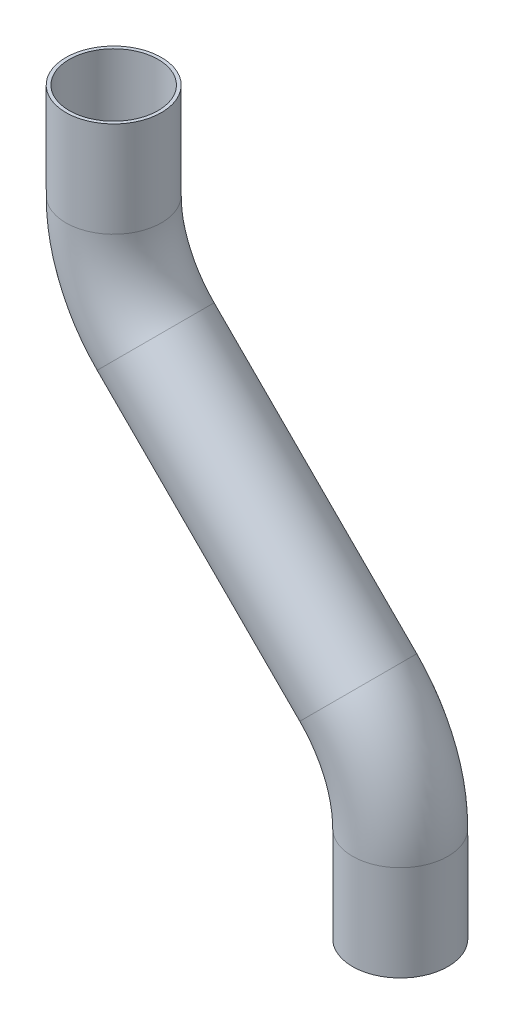
ISO-10303-21;
HEADER;
FILE_DESCRIPTION(('STEP AP214'),'2;1');
FILE_NAME('part.step','',(''),(''),'','','');
FILE_SCHEMA(('AUTOMOTIVE_DESIGN { 1 0 10303 214 1 1 1 1 }'));
ENDSEC;
DATA;
#1=APPLICATION_CONTEXT('core data for automotive mechanical design processes');
#2=APPLICATION_PROTOCOL_DEFINITION('international standard','automotive_design',2000,#1);
#3=PRODUCT_CONTEXT('',#1,'mechanical');
#4=PRODUCT('Part','Part','',(#3));
#5=PRODUCT_RELATED_PRODUCT_CATEGORY('part','',(#4));
#6=PRODUCT_DEFINITION_FORMATION('','',#4);
#7=PRODUCT_DEFINITION_CONTEXT('part definition',#1,'design');
#8=PRODUCT_DEFINITION('design','',#6,#7);
#9=PRODUCT_DEFINITION_SHAPE('','',#8);
#10=(LENGTH_UNIT() NAMED_UNIT(*) SI_UNIT(.MILLI.,.METRE.));
#11=(NAMED_UNIT(*) PLANE_ANGLE_UNIT() SI_UNIT($,.RADIAN.));
#12=(NAMED_UNIT(*) SI_UNIT($,.STERADIAN.) SOLID_ANGLE_UNIT());
#13=UNCERTAINTY_MEASURE_WITH_UNIT(LENGTH_MEASURE(1.E-05),#10,'distance_accuracy_value','');
#14=(GEOMETRIC_REPRESENTATION_CONTEXT(3) GLOBAL_UNCERTAINTY_ASSIGNED_CONTEXT((#13)) GLOBAL_UNIT_ASSIGNED_CONTEXT((#10,
#11,#12)) REPRESENTATION_CONTEXT('',''));
#15=CARTESIAN_POINT('',(0.,0.,0.));
#16=DIRECTION('',(0.,0.,1.));
#17=DIRECTION('',(1.,0.,0.));
#18=AXIS2_PLACEMENT_3D('',#15,#16,#17);
#19=CARTESIAN_POINT('',(0.,0.,0.));
#20=DIRECTION('',(0.,1.,0.));
#21=DIRECTION('',(0.,0.,1.));
#22=AXIS2_PLACEMENT_3D('',#19,#20,#21);
#23=CYLINDRICAL_SURFACE('',#22,12.7);
#24=CARTESIAN_POINT('',(0.,25.4,0.));
#25=DIRECTION('',(0.,1.,0.));
#26=DIRECTION('',(0.,0.,1.));
#27=AXIS2_PLACEMENT_3D('',#24,#25,#26);
#28=CIRCLE('',#27,12.7);
#29=CARTESIAN_POINT('',(12.7,25.4,0.));
#30=VERTEX_POINT('',#29);
#31=EDGE_CURVE('E55',#30,#30,#28,.T.);
#32=ORIENTED_EDGE('',*,*,#31,.F.);
#33=EDGE_LOOP('',(#32));
#34=FACE_BOUND('',#33,.T.);
#35=CARTESIAN_POINT('',(0.,0.,0.));
#36=DIRECTION('',(0.,1.,0.));
#37=DIRECTION('',(0.,0.,1.));
#38=AXIS2_PLACEMENT_3D('',#35,#36,#37);
#39=CIRCLE('',#38,12.7);
#40=CARTESIAN_POINT('',(0.,0.,12.7));
#41=VERTEX_POINT('',#40);
#42=EDGE_CURVE('E52',#41,#41,#39,.T.);
#43=ORIENTED_EDGE('',*,*,#42,.T.);
#44=EDGE_LOOP('',(#43));
#45=FACE_BOUND('',#44,.T.);
#46=ADVANCED_FACE('F31',(#34,#45),#23,.T.);
#47=CARTESIAN_POINT('',(-38.1,25.4,0.));
#48=DIRECTION('',(0.,0.,1.));
#49=DIRECTION('',(1.,0.,0.));
#50=AXIS2_PLACEMENT_3D('',#47,#48,#49);
#51=TOROIDAL_SURFACE('',#50,38.1,12.7);
#52=CARTESIAN_POINT('',(-11.1592316367926,52.3407683632075,0.));
#53=DIRECTION('',(-0.707106781186549,0.707106781186546,0.));
#54=DIRECTION('',(0.,0.,1.));
#55=AXIS2_PLACEMENT_3D('',#52,#53,#54);
#56=CIRCLE('',#55,12.7);
#57=CARTESIAN_POINT('',(-2.17897551572346,61.3210244842767,0.));
#58=VERTEX_POINT('',#57);
#59=EDGE_CURVE('E58',#58,#58,#56,.T.);
#60=CARTESIAN_POINT('',(-38.1,25.4,0.));
#61=DIRECTION('',(0.,0.,1.));
#62=DIRECTION('',(1.,0.,0.));
#63=AXIS2_PLACEMENT_3D('',#60,#61,#62);
#64=CIRCLE('',#63,50.8);
#65=EDGE_CURVE('',#30,#58,#64,.T.);
#66=ORIENTED_EDGE('',*,*,#31,.T.);
#67=ORIENTED_EDGE('',*,*,#59,.F.);
#68=ORIENTED_EDGE('',*,*,#65,.T.);
#69=ORIENTED_EDGE('',*,*,#65,.F.);
#70=EDGE_LOOP('',(#66,#68,#67,#69));
#71=FACE_BOUND('',#70,.T.);
#72=ADVANCED_FACE('F77',(#71),#51,.T.);
#73=CARTESIAN_POINT('',(-11.1592316367926,52.3407683632075,0.));
#74=DIRECTION('',(-0.707106781186549,0.707106781186546,0.));
#75=DIRECTION('',(-0.707106781186546,-0.707106781186549,0.));
#76=AXIS2_PLACEMENT_3D('',#73,#74,#75);
#77=CYLINDRICAL_SURFACE('',#76,12.7);
#78=CARTESIAN_POINT('',(-65.0407683632074,106.222305089622,0.));
#79=DIRECTION('',(-0.707106781186549,0.707106781186546,0.));
#80=DIRECTION('',(0.,0.,1.));
#81=AXIS2_PLACEMENT_3D('',#78,#79,#80);
#82=CIRCLE('',#81,12.7);
#83=CARTESIAN_POINT('',(-74.0210244842766,97.242048968553,0.));
#84=VERTEX_POINT('',#83);
#85=EDGE_CURVE('E60',#84,#84,#82,.T.);
#86=ORIENTED_EDGE('',*,*,#85,.F.);
#87=EDGE_LOOP('',(#86));
#88=FACE_BOUND('',#87,.T.);
#89=ORIENTED_EDGE('',*,*,#59,.T.);
#90=EDGE_LOOP('',(#89));
#91=FACE_BOUND('',#90,.T.);
#92=ADVANCED_FACE('F70',(#88,#91),#77,.T.);
#93=CARTESIAN_POINT('',(-38.1,133.16307345283,0.));
#94=DIRECTION('',(0.,0.,-1.));
#95=DIRECTION('',(-1.,0.,0.));
#96=AXIS2_PLACEMENT_3D('',#93,#94,#95);
#97=TOROIDAL_SURFACE('',#96,38.1,12.7);
#98=CARTESIAN_POINT('',(-76.2,133.16307345283,0.));
#99=DIRECTION('',(0.,1.,0.));
#100=DIRECTION('',(0.,0.,1.));
#101=AXIS2_PLACEMENT_3D('',#98,#99,#100);
#102=CIRCLE('',#101,12.7);
#103=CARTESIAN_POINT('',(-88.9,133.16307345283,0.));
#104=VERTEX_POINT('',#103);
#105=EDGE_CURVE('E35',#104,#104,#102,.T.);
#106=CARTESIAN_POINT('',(-38.1,133.16307345283,0.));
#107=DIRECTION('',(0.,0.,-1.));
#108=DIRECTION('',(-1.,0.,0.));
#109=AXIS2_PLACEMENT_3D('',#106,#107,#108);
#110=CIRCLE('',#109,50.8);
#111=EDGE_CURVE('',#84,#104,#110,.T.);
#112=ORIENTED_EDGE('',*,*,#85,.T.);
#113=ORIENTED_EDGE('',*,*,#105,.F.);
#114=ORIENTED_EDGE('',*,*,#111,.T.);
#115=ORIENTED_EDGE('',*,*,#111,.F.);
#116=EDGE_LOOP('',(#112,#114,#113,#115));
#117=FACE_BOUND('',#116,.T.);
#118=ADVANCED_FACE('F68',(#117),#97,.T.);
#119=CARTESIAN_POINT('',(-76.2,133.16307345283,0.));
#120=DIRECTION('',(0.,1.,0.));
#121=DIRECTION('',(0.,0.,1.));
#122=AXIS2_PLACEMENT_3D('',#119,#120,#121);
#123=CYLINDRICAL_SURFACE('',#122,12.7);
#124=CARTESIAN_POINT('',(-76.2,158.56307345283,0.));
#125=DIRECTION('',(0.,1.,0.));
#126=DIRECTION('',(0.,0.,1.));
#127=AXIS2_PLACEMENT_3D('',#124,#125,#126);
#128=CIRCLE('',#127,12.7);
#129=CARTESIAN_POINT('',(-76.2,158.56307345283,12.7));
#130=VERTEX_POINT('',#129);
#131=EDGE_CURVE('E48',#130,#130,#128,.T.);
#132=ORIENTED_EDGE('',*,*,#131,.F.);
#133=EDGE_LOOP('',(#132));
#134=FACE_BOUND('',#133,.T.);
#135=ORIENTED_EDGE('',*,*,#105,.T.);
#136=EDGE_LOOP('',(#135));
#137=FACE_BOUND('',#136,.T.);
#138=ADVANCED_FACE('F33',(#134,#137),#123,.T.);
#139=CARTESIAN_POINT('',(0.,0.,0.));
#140=DIRECTION('',(0.,1.,0.));
#141=DIRECTION('',(0.,0.,1.));
#142=AXIS2_PLACEMENT_3D('',#139,#140,#141);
#143=PLANE('',#142);
#144=CARTESIAN_POINT('',(0.,0.,0.));
#145=DIRECTION('',(0.,1.,0.));
#146=DIRECTION('',(0.,0.,1.));
#147=AXIS2_PLACEMENT_3D('',#144,#145,#146);
#148=CIRCLE('',#147,11.811);
#149=CARTESIAN_POINT('',(0.,0.,11.811));
#150=VERTEX_POINT('',#149);
#151=EDGE_CURVE('E51',#150,#150,#148,.F.);
#152=ORIENTED_EDGE('',*,*,#151,.F.);
#153=EDGE_LOOP('',(#152));
#154=FACE_BOUND('',#153,.T.);
#155=ORIENTED_EDGE('',*,*,#42,.F.);
#156=EDGE_LOOP('',(#155));
#157=FACE_BOUND('',#156,.T.);
#158=ADVANCED_FACE('F75',(#154,#157),#143,.F.);
#159=CARTESIAN_POINT('',(-76.2,158.56307345283,0.));
#160=DIRECTION('',(0.,1.,0.));
#161=DIRECTION('',(0.,0.,1.));
#162=AXIS2_PLACEMENT_3D('',#159,#160,#161);
#163=PLANE('',#162);
#164=CARTESIAN_POINT('',(-76.2,158.56307345283,0.));
#165=DIRECTION('',(0.,1.,0.));
#166=DIRECTION('',(0.,0.,1.));
#167=AXIS2_PLACEMENT_3D('',#164,#165,#166);
#168=CIRCLE('',#167,11.811);
#169=CARTESIAN_POINT('',(-76.2,158.56307345283,11.811));
#170=VERTEX_POINT('',#169);
#171=EDGE_CURVE('E10',#170,#170,#168,.F.);
#172=ORIENTED_EDGE('',*,*,#171,.T.);
#173=EDGE_LOOP('',(#172));
#174=FACE_BOUND('',#173,.T.);
#175=ORIENTED_EDGE('',*,*,#131,.T.);
#176=EDGE_LOOP('',(#175));
#177=FACE_BOUND('',#176,.T.);
#178=ADVANCED_FACE('F94',(#174,#177),#163,.T.);
#179=CARTESIAN_POINT('',(0.,0.,0.));
#180=DIRECTION('',(0.,1.,0.));
#181=DIRECTION('',(0.,0.,1.));
#182=AXIS2_PLACEMENT_3D('',#179,#180,#181);
#183=CYLINDRICAL_SURFACE('',#182,11.811);
#184=CARTESIAN_POINT('',(0.,25.4,0.));
#185=DIRECTION('',(0.,1.,0.));
#186=DIRECTION('',(0.,0.,1.));
#187=AXIS2_PLACEMENT_3D('',#184,#185,#186);
#188=CIRCLE('',#187,11.811);
#189=CARTESIAN_POINT('',(11.811,25.4,0.));
#190=VERTEX_POINT('',#189);
#191=EDGE_CURVE('E190',#190,#190,#188,.F.);
#192=ORIENTED_EDGE('',*,*,#191,.F.);
#193=EDGE_LOOP('',(#192));
#194=FACE_BOUND('',#193,.T.);
#195=ORIENTED_EDGE('',*,*,#151,.T.);
#196=EDGE_LOOP('',(#195));
#197=FACE_BOUND('',#196,.T.);
#198=ADVANCED_FACE('F97',(#194,#197),#183,.F.);
#199=CARTESIAN_POINT('',(-38.1,25.4,0.));
#200=DIRECTION('',(0.,0.,1.));
#201=DIRECTION('',(1.,0.,0.));
#202=AXIS2_PLACEMENT_3D('',#199,#200,#201);
#203=TOROIDAL_SURFACE('',#202,38.1,11.811);
#204=CARTESIAN_POINT('',(-11.1592316367926,52.3407683632075,0.));
#205=DIRECTION('',(-0.707106781186549,0.707106781186546,0.));
#206=DIRECTION('',(0.,0.,1.));
#207=AXIS2_PLACEMENT_3D('',#204,#205,#206);
#208=CIRCLE('',#207,11.811);
#209=CARTESIAN_POINT('',(-2.80759344419829,60.6924065558018,0.));
#210=VERTEX_POINT('',#209);
#211=EDGE_CURVE('E189',#210,#210,#208,.F.);
#212=CARTESIAN_POINT('',(-38.1,25.4,0.));
#213=DIRECTION('',(0.,0.,1.));
#214=DIRECTION('',(1.,0.,0.));
#215=AXIS2_PLACEMENT_3D('',#212,#213,#214);
#216=CIRCLE('',#215,49.911);
#217=EDGE_CURVE('',#190,#210,#216,.T.);
#218=ORIENTED_EDGE('',*,*,#191,.T.);
#219=ORIENTED_EDGE('',*,*,#211,.F.);
#220=ORIENTED_EDGE('',*,*,#217,.T.);
#221=ORIENTED_EDGE('',*,*,#217,.F.);
#222=EDGE_LOOP('',(#218,#220,#219,#221));
#223=FACE_BOUND('',#222,.T.);
#224=ADVANCED_FACE('F152',(#223),#203,.F.);
#225=CARTESIAN_POINT('',(-11.1592316367926,52.3407683632075,0.));
#226=DIRECTION('',(-0.707106781186549,0.707106781186546,0.));
#227=DIRECTION('',(-0.707106781186546,-0.707106781186549,0.));
#228=AXIS2_PLACEMENT_3D('',#225,#226,#227);
#229=CYLINDRICAL_SURFACE('',#228,11.811);
#230=CARTESIAN_POINT('',(-65.0407683632074,106.222305089622,0.));
#231=DIRECTION('',(-0.707106781186549,0.707106781186546,0.));
#232=DIRECTION('',(0.,0.,1.));
#233=AXIS2_PLACEMENT_3D('',#230,#231,#232);
#234=CIRCLE('',#233,11.811);
#235=CARTESIAN_POINT('',(-73.3924065558017,97.8706668970278,0.));
#236=VERTEX_POINT('',#235);
#237=EDGE_CURVE('E44',#236,#236,#234,.F.);
#238=ORIENTED_EDGE('',*,*,#237,.F.);
#239=EDGE_LOOP('',(#238));
#240=FACE_BOUND('',#239,.T.);
#241=ORIENTED_EDGE('',*,*,#211,.T.);
#242=EDGE_LOOP('',(#241));
#243=FACE_BOUND('',#242,.T.);
#244=ADVANCED_FACE('F88',(#240,#243),#229,.F.);
#245=CARTESIAN_POINT('',(-38.1,133.16307345283,0.));
#246=DIRECTION('',(0.,0.,-1.));
#247=DIRECTION('',(-1.,0.,0.));
#248=AXIS2_PLACEMENT_3D('',#245,#246,#247);
#249=TOROIDAL_SURFACE('',#248,38.1,11.811);
#250=CARTESIAN_POINT('',(-76.2,133.16307345283,0.));
#251=DIRECTION('',(0.,1.,0.));
#252=DIRECTION('',(0.,0.,1.));
#253=AXIS2_PLACEMENT_3D('',#250,#251,#252);
#254=CIRCLE('',#253,11.811);
#255=CARTESIAN_POINT('',(-88.011,133.16307345283,0.));
#256=VERTEX_POINT('',#255);
#257=EDGE_CURVE('E39',#256,#256,#254,.F.);
#258=CARTESIAN_POINT('',(-38.1,133.16307345283,0.));
#259=DIRECTION('',(0.,0.,-1.));
#260=DIRECTION('',(-1.,0.,0.));
#261=AXIS2_PLACEMENT_3D('',#258,#259,#260);
#262=CIRCLE('',#261,49.911);
#263=EDGE_CURVE('',#236,#256,#262,.T.);
#264=ORIENTED_EDGE('',*,*,#237,.T.);
#265=ORIENTED_EDGE('',*,*,#257,.F.);
#266=ORIENTED_EDGE('',*,*,#263,.T.);
#267=ORIENTED_EDGE('',*,*,#263,.F.);
#268=EDGE_LOOP('',(#264,#266,#265,#267));
#269=FACE_BOUND('',#268,.T.);
#270=ADVANCED_FACE('F82',(#269),#249,.F.);
#271=CARTESIAN_POINT('',(-76.2,133.16307345283,0.));
#272=DIRECTION('',(0.,1.,0.));
#273=DIRECTION('',(0.,0.,1.));
#274=AXIS2_PLACEMENT_3D('',#271,#272,#273);
#275=CYLINDRICAL_SURFACE('',#274,11.811);
#276=ORIENTED_EDGE('',*,*,#171,.F.);
#277=EDGE_LOOP('',(#276));
#278=FACE_BOUND('',#277,.T.);
#279=ORIENTED_EDGE('',*,*,#257,.T.);
#280=EDGE_LOOP('',(#279));
#281=FACE_BOUND('',#280,.T.);
#282=ADVANCED_FACE('F80',(#278,#281),#275,.F.);
#283=CLOSED_SHELL('',(#46,#72,#92,#118,#138,#158,#178,#198,#224,#244,#270,#282));
#284=MANIFOLD_SOLID_BREP('B2',#283);
#285=ADVANCED_BREP_SHAPE_REPRESENTATION('',(#18,#284),#14);
#286=SHAPE_DEFINITION_REPRESENTATION(#9,#285);
ENDSEC;
END-ISO-10303-21;
